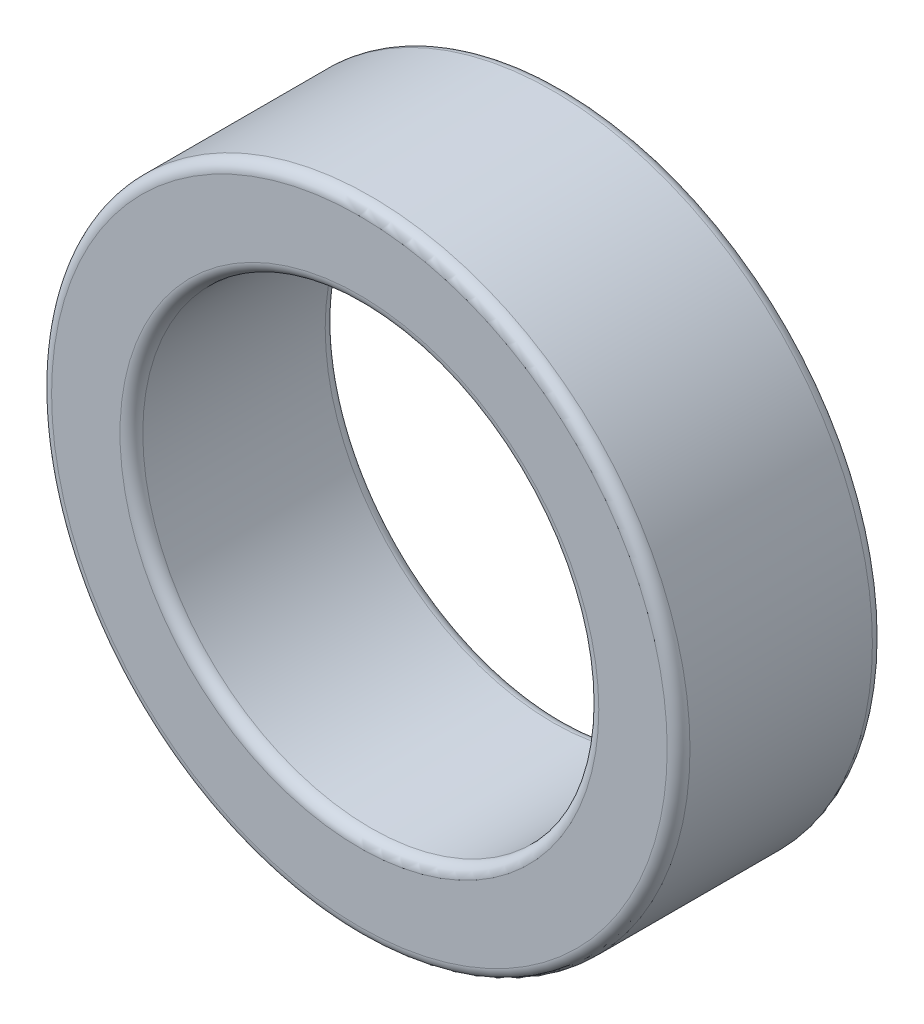
ISO-10303-21;
HEADER;
FILE_DESCRIPTION(('STEP AP214'),'2;1');
FILE_NAME('part.step','',(''),(''),'','','');
FILE_SCHEMA(('AUTOMOTIVE_DESIGN { 1 0 10303 214 1 1 1 1 }'));
ENDSEC;
DATA;
#1=APPLICATION_CONTEXT('core data for automotive mechanical design processes');
#2=APPLICATION_PROTOCOL_DEFINITION('international standard','automotive_design',2000,#1);
#3=PRODUCT_CONTEXT('',#1,'mechanical');
#4=PRODUCT('Part','Part','',(#3));
#5=PRODUCT_RELATED_PRODUCT_CATEGORY('part','',(#4));
#6=PRODUCT_DEFINITION_FORMATION('','',#4);
#7=PRODUCT_DEFINITION_CONTEXT('part definition',#1,'design');
#8=PRODUCT_DEFINITION('design','',#6,#7);
#9=PRODUCT_DEFINITION_SHAPE('','',#8);
#10=(LENGTH_UNIT() NAMED_UNIT(*) SI_UNIT(.MILLI.,.METRE.));
#11=(NAMED_UNIT(*) PLANE_ANGLE_UNIT() SI_UNIT($,.RADIAN.));
#12=(NAMED_UNIT(*) SI_UNIT($,.STERADIAN.) SOLID_ANGLE_UNIT());
#13=UNCERTAINTY_MEASURE_WITH_UNIT(LENGTH_MEASURE(1.E-05),#10,'distance_accuracy_value','');
#14=(GEOMETRIC_REPRESENTATION_CONTEXT(3) GLOBAL_UNCERTAINTY_ASSIGNED_CONTEXT((#13)) GLOBAL_UNIT_ASSIGNED_CONTEXT((#10,
#11,#12)) REPRESENTATION_CONTEXT('',''));
#15=CARTESIAN_POINT('',(0.,0.,0.));
#16=DIRECTION('',(0.,0.,1.));
#17=DIRECTION('',(1.,0.,0.));
#18=AXIS2_PLACEMENT_3D('',#15,#16,#17);
#19=CARTESIAN_POINT('',(0.,0.,2.25));
#20=DIRECTION('',(0.,0.,1.));
#21=DIRECTION('',(1.,0.,0.));
#22=AXIS2_PLACEMENT_3D('',#19,#20,#21);
#23=PLANE('',#22);
#24=CARTESIAN_POINT('',(0.,0.,2.25));
#25=DIRECTION('',(0.,0.,1.));
#26=DIRECTION('',(1.,0.,0.));
#27=AXIS2_PLACEMENT_3D('',#24,#25,#26);
#28=CIRCLE('',#27,5.25);
#29=CARTESIAN_POINT('',(5.25,0.,2.25));
#30=VERTEX_POINT('',#29);
#31=EDGE_CURVE('E49',#30,#30,#28,.F.);
#32=ORIENTED_EDGE('',*,*,#31,.T.);
#33=EDGE_LOOP('',(#32));
#34=FACE_BOUND('',#33,.T.);
#35=CARTESIAN_POINT('',(0.,0.,2.25));
#36=DIRECTION('',(0.,0.,1.));
#37=DIRECTION('',(1.,0.,0.));
#38=AXIS2_PLACEMENT_3D('',#35,#36,#37);
#39=CIRCLE('',#38,6.75);
#40=CARTESIAN_POINT('',(6.75,0.,2.25));
#41=VERTEX_POINT('',#40);
#42=EDGE_CURVE('E53',#41,#41,#39,.T.);
#43=ORIENTED_EDGE('',*,*,#42,.T.);
#44=EDGE_LOOP('',(#43));
#45=FACE_BOUND('',#44,.T.);
#46=ADVANCED_FACE('F38',(#34,#45),#23,.T.);
#47=CARTESIAN_POINT('',(0.,0.,-2.25));
#48=DIRECTION('',(0.,0.,1.));
#49=DIRECTION('',(1.,0.,0.));
#50=AXIS2_PLACEMENT_3D('',#47,#48,#49);
#51=PLANE('',#50);
#52=CARTESIAN_POINT('',(0.,0.,-2.25));
#53=DIRECTION('',(0.,0.,1.));
#54=DIRECTION('',(1.,0.,0.));
#55=AXIS2_PLACEMENT_3D('',#52,#53,#54);
#56=CIRCLE('',#55,5.25);
#57=CARTESIAN_POINT('',(5.25,0.,-2.25));
#58=VERTEX_POINT('',#57);
#59=EDGE_CURVE('E64',#58,#58,#56,.T.);
#60=ORIENTED_EDGE('',*,*,#59,.T.);
#61=EDGE_LOOP('',(#60));
#62=FACE_BOUND('',#61,.T.);
#63=CARTESIAN_POINT('',(0.,0.,-2.25));
#64=DIRECTION('',(0.,0.,1.));
#65=DIRECTION('',(1.,0.,0.));
#66=AXIS2_PLACEMENT_3D('',#63,#64,#65);
#67=CIRCLE('',#66,6.75);
#68=CARTESIAN_POINT('',(6.75,0.,-2.25));
#69=VERTEX_POINT('',#68);
#70=EDGE_CURVE('E67',#69,#69,#67,.F.);
#71=ORIENTED_EDGE('',*,*,#70,.T.);
#72=EDGE_LOOP('',(#71));
#73=FACE_BOUND('',#72,.T.);
#74=ADVANCED_FACE('F71',(#62,#73),#51,.F.);
#75=CARTESIAN_POINT('',(0.,0.,2.25));
#76=DIRECTION('',(0.,0.,-1.));
#77=DIRECTION('',(-1.,0.,0.));
#78=AXIS2_PLACEMENT_3D('',#75,#76,#77);
#79=CYLINDRICAL_SURFACE('',#78,7.);
#80=CARTESIAN_POINT('',(0.,0.,-2.));
#81=DIRECTION('',(0.,0.,1.));
#82=DIRECTION('',(1.,0.,0.));
#83=AXIS2_PLACEMENT_3D('',#80,#81,#82);
#84=CIRCLE('',#83,7.);
#85=CARTESIAN_POINT('',(7.,0.,-2.));
#86=VERTEX_POINT('',#85);
#87=EDGE_CURVE('E10',#86,#86,#84,.T.);
#88=ORIENTED_EDGE('',*,*,#87,.T.);
#89=EDGE_LOOP('',(#88));
#90=FACE_BOUND('',#89,.T.);
#91=CARTESIAN_POINT('',(0.,0.,2.));
#92=DIRECTION('',(0.,0.,1.));
#93=DIRECTION('',(1.,0.,0.));
#94=AXIS2_PLACEMENT_3D('',#91,#92,#93);
#95=CIRCLE('',#94,7.);
#96=CARTESIAN_POINT('',(7.,0.,2.));
#97=VERTEX_POINT('',#96);
#98=EDGE_CURVE('E45',#97,#97,#95,.F.);
#99=ORIENTED_EDGE('',*,*,#98,.T.);
#100=EDGE_LOOP('',(#99));
#101=FACE_BOUND('',#100,.T.);
#102=ADVANCED_FACE('F91',(#90,#101),#79,.T.);
#103=CARTESIAN_POINT('',(0.,0.,2.25));
#104=DIRECTION('',(0.,0.,-1.));
#105=DIRECTION('',(-1.,0.,0.));
#106=AXIS2_PLACEMENT_3D('',#103,#104,#105);
#107=CYLINDRICAL_SURFACE('',#106,5.);
#108=CARTESIAN_POINT('',(0.,0.,-2.));
#109=DIRECTION('',(0.,0.,1.));
#110=DIRECTION('',(1.,0.,0.));
#111=AXIS2_PLACEMENT_3D('',#108,#109,#110);
#112=CIRCLE('',#111,5.);
#113=CARTESIAN_POINT('',(5.,0.,-2.));
#114=VERTEX_POINT('',#113);
#115=EDGE_CURVE('E58',#114,#114,#112,.F.);
#116=ORIENTED_EDGE('',*,*,#115,.T.);
#117=EDGE_LOOP('',(#116));
#118=FACE_BOUND('',#117,.T.);
#119=CARTESIAN_POINT('',(0.,0.,2.));
#120=DIRECTION('',(0.,0.,1.));
#121=DIRECTION('',(1.,0.,0.));
#122=AXIS2_PLACEMENT_3D('',#119,#120,#121);
#123=CIRCLE('',#122,5.);
#124=CARTESIAN_POINT('',(5.,0.,2.));
#125=VERTEX_POINT('',#124);
#126=EDGE_CURVE('E61',#125,#125,#123,.T.);
#127=ORIENTED_EDGE('',*,*,#126,.T.);
#128=EDGE_LOOP('',(#127));
#129=FACE_BOUND('',#128,.T.);
#130=ADVANCED_FACE('F96',(#118,#129),#107,.F.);
#131=CARTESIAN_POINT('',(0.,0.,-2.));
#132=DIRECTION('',(0.,0.,1.));
#133=DIRECTION('',(1.,0.,0.));
#134=AXIS2_PLACEMENT_3D('',#131,#132,#133);
#135=TOROIDAL_SURFACE('',#134,5.25,0.25);
#136=ORIENTED_EDGE('',*,*,#115,.F.);
#137=EDGE_LOOP('',(#136));
#138=FACE_BOUND('',#137,.T.);
#139=ORIENTED_EDGE('',*,*,#59,.F.);
#140=EDGE_LOOP('',(#139));
#141=FACE_BOUND('',#140,.T.);
#142=ADVANCED_FACE('F82',(#138,#141),#135,.T.);
#143=CARTESIAN_POINT('',(0.,0.,2.));
#144=DIRECTION('',(0.,0.,1.));
#145=DIRECTION('',(1.,0.,0.));
#146=AXIS2_PLACEMENT_3D('',#143,#144,#145);
#147=TOROIDAL_SURFACE('',#146,5.25,0.25);
#148=ORIENTED_EDGE('',*,*,#31,.F.);
#149=EDGE_LOOP('',(#148));
#150=FACE_BOUND('',#149,.T.);
#151=ORIENTED_EDGE('',*,*,#126,.F.);
#152=EDGE_LOOP('',(#151));
#153=FACE_BOUND('',#152,.T.);
#154=ADVANCED_FACE('F76',(#150,#153),#147,.T.);
#155=CARTESIAN_POINT('',(0.,0.,-2.));
#156=DIRECTION('',(0.,0.,1.));
#157=DIRECTION('',(1.,0.,0.));
#158=AXIS2_PLACEMENT_3D('',#155,#156,#157);
#159=TOROIDAL_SURFACE('',#158,6.75,0.25);
#160=ORIENTED_EDGE('',*,*,#70,.F.);
#161=EDGE_LOOP('',(#160));
#162=FACE_BOUND('',#161,.T.);
#163=ORIENTED_EDGE('',*,*,#87,.F.);
#164=EDGE_LOOP('',(#163));
#165=FACE_BOUND('',#164,.T.);
#166=ADVANCED_FACE('F73',(#162,#165),#159,.T.);
#167=CARTESIAN_POINT('',(0.,0.,2.));
#168=DIRECTION('',(0.,0.,1.));
#169=DIRECTION('',(1.,0.,0.));
#170=AXIS2_PLACEMENT_3D('',#167,#168,#169);
#171=TOROIDAL_SURFACE('',#170,6.75,0.25);
#172=ORIENTED_EDGE('',*,*,#98,.F.);
#173=EDGE_LOOP('',(#172));
#174=FACE_BOUND('',#173,.T.);
#175=ORIENTED_EDGE('',*,*,#42,.F.);
#176=EDGE_LOOP('',(#175));
#177=FACE_BOUND('',#176,.T.);
#178=ADVANCED_FACE('F40',(#174,#177),#171,.T.);
#179=CLOSED_SHELL('',(#46,#74,#102,#130,#142,#154,#166,#178));
#180=MANIFOLD_SOLID_BREP('B2',#179);
#181=ADVANCED_BREP_SHAPE_REPRESENTATION('',(#18,#180),#14);
#182=SHAPE_DEFINITION_REPRESENTATION(#9,#181);
ENDSEC;
END-ISO-10303-21;
